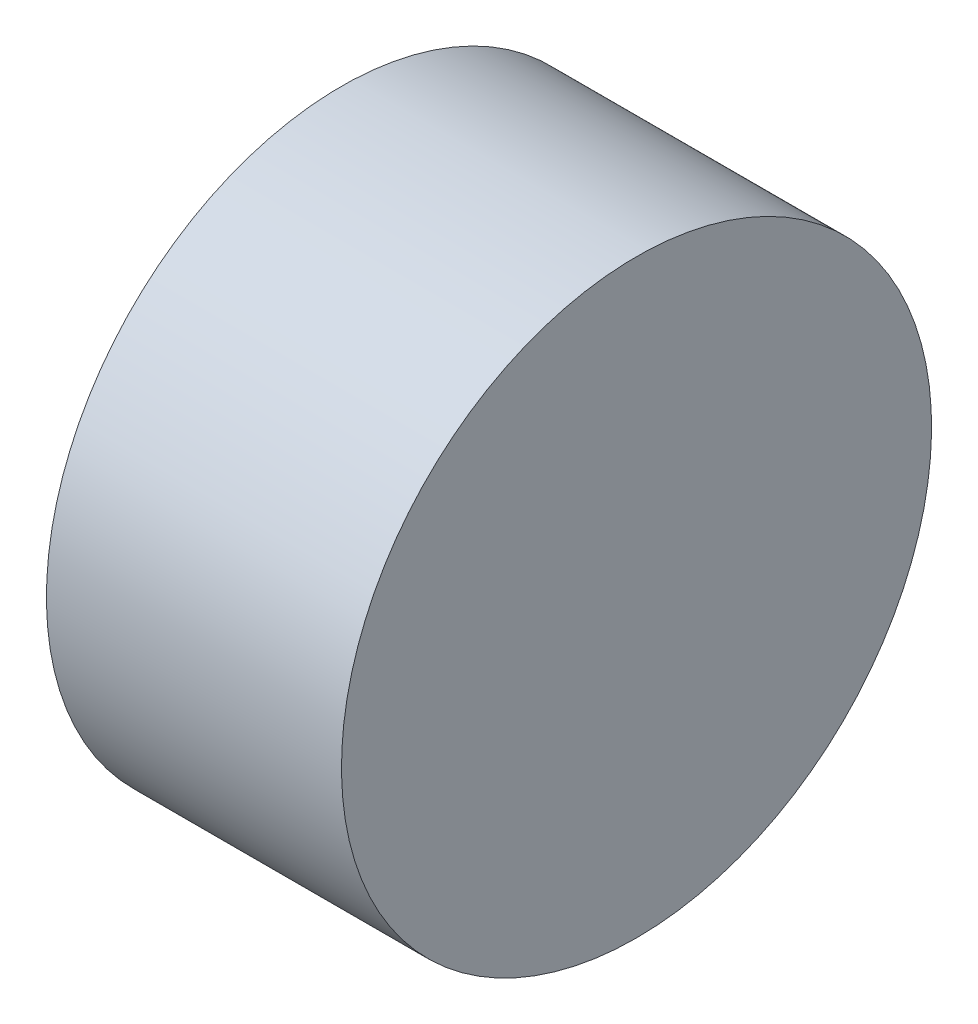
ISO-10303-21;
HEADER;
FILE_DESCRIPTION(('STEP AP214'),'2;1');
FILE_NAME('part.step','',(''),(''),'','','');
FILE_SCHEMA(('AUTOMOTIVE_DESIGN { 1 0 10303 214 1 1 1 1 }'));
ENDSEC;
DATA;
#1=APPLICATION_CONTEXT('core data for automotive mechanical design processes');
#2=APPLICATION_PROTOCOL_DEFINITION('international standard','automotive_design',2000,#1);
#3=PRODUCT_CONTEXT('',#1,'mechanical');
#4=PRODUCT('Part','Part','',(#3));
#5=PRODUCT_RELATED_PRODUCT_CATEGORY('part','',(#4));
#6=PRODUCT_DEFINITION_FORMATION('','',#4);
#7=PRODUCT_DEFINITION_CONTEXT('part definition',#1,'design');
#8=PRODUCT_DEFINITION('design','',#6,#7);
#9=PRODUCT_DEFINITION_SHAPE('','',#8);
#10=(LENGTH_UNIT() NAMED_UNIT(*) SI_UNIT(.MILLI.,.METRE.));
#11=(NAMED_UNIT(*) PLANE_ANGLE_UNIT() SI_UNIT($,.RADIAN.));
#12=(NAMED_UNIT(*) SI_UNIT($,.STERADIAN.) SOLID_ANGLE_UNIT());
#13=UNCERTAINTY_MEASURE_WITH_UNIT(LENGTH_MEASURE(1.E-05),#10,'distance_accuracy_value','');
#14=(GEOMETRIC_REPRESENTATION_CONTEXT(3) GLOBAL_UNCERTAINTY_ASSIGNED_CONTEXT((#13)) GLOBAL_UNIT_ASSIGNED_CONTEXT((#10,
#11,#12)) REPRESENTATION_CONTEXT('',''));
#15=CARTESIAN_POINT('',(0.,0.,0.));
#16=DIRECTION('',(0.,0.,1.));
#17=DIRECTION('',(1.,0.,0.));
#18=AXIS2_PLACEMENT_3D('',#15,#16,#17);
#19=CARTESIAN_POINT('',(-12.750267124833,2.2459752918337,0.));
#20=DIRECTION('',(0.,1.,0.));
#21=DIRECTION('',(-1.,0.,0.));
#22=AXIS2_PLACEMENT_3D('',#19,#20,#21);
#23=SPHERICAL_SURFACE('',#22,5.1054);
#24=CARTESIAN_POINT('',(-12.750267124833,7.3513752918337,0.));
#25=VERTEX_POINT('',#24);
#26=VERTEX_LOOP('',#25);
#27=FACE_BOUND('',#26,.T.);
#28=ADVANCED_FACE('F39',(#27),#23,.T.);
#29=CLOSED_SHELL('',(#28));
#30=MANIFOLD_SOLID_BREP('B2',#29);
#31=CARTESIAN_POINT('',(-2.59026712483303,14.6919752918337,6.35));
#32=DIRECTION('',(0.,0.,1.));
#33=DIRECTION('',(1.,0.,0.));
#34=AXIS2_PLACEMENT_3D('',#31,#32,#33);
#35=PLANE('',#34);
#36=CARTESIAN_POINT('',(-2.59026712483303,14.6919752918337,6.35));
#37=DIRECTION('',(0.,0.,1.));
#38=DIRECTION('',(1.,0.,0.));
#39=AXIS2_PLACEMENT_3D('',#36,#37,#38);
#40=CIRCLE('',#39,1.905);
#41=CARTESIAN_POINT('',(-0.685267124833033,14.6919752918337,6.35));
#42=VERTEX_POINT('',#41);
#43=EDGE_CURVE('E125',#42,#42,#40,.T.);
#44=ORIENTED_EDGE('',*,*,#43,.F.);
#45=EDGE_LOOP('',(#44));
#46=FACE_BOUND('',#45,.T.);
#47=CARTESIAN_POINT('',(-2.59026712483303,14.6919752918337,6.35));
#48=DIRECTION('',(0.,0.,1.));
#49=DIRECTION('',(1.,0.,0.));
#50=AXIS2_PLACEMENT_3D('',#47,#48,#49);
#51=CIRCLE('',#50,4.32358968551349);
#52=CARTESIAN_POINT('',(-1.26229326673769,10.5773777172349,6.35));
#53=VERTEX_POINT('',#52);
#54=CARTESIAN_POINT('',(-2.59026712483303,10.3683856063202,6.35));
#55=VERTEX_POINT('',#54);
#56=EDGE_CURVE('E110',#53,#55,#51,.T.);
#57=ORIENTED_EDGE('',*,*,#56,.T.);
#58=DIRECTION('',(0.,-1.,0.));
#59=VECTOR('',#58,1.);
#60=CARTESIAN_POINT('',(-2.59026712483303,10.3683856063202,6.35));
#61=LINE('',#60,#59);
#62=CARTESIAN_POINT('',(-2.59026712483303,-5.87643502265281,6.35));
#63=VERTEX_POINT('',#62);
#64=EDGE_CURVE('E105',#55,#63,#61,.T.);
#65=ORIENTED_EDGE('',*,*,#64,.T.);
#66=CARTESIAN_POINT('',(-2.59026712483303,-10.2000247081663,6.35));
#67=DIRECTION('',(0.,0.,1.));
#68=DIRECTION('',(1.,0.,0.));
#69=AXIS2_PLACEMENT_3D('',#66,#67,#68);
#70=CIRCLE('',#69,4.32358968551349);
#71=CARTESIAN_POINT('',(1.24129482385524,-8.19688696900736,6.35));
#72=VERTEX_POINT('',#71);
#73=EDGE_CURVE('E108',#63,#72,#70,.T.);
#74=ORIENTED_EDGE('',*,*,#73,.T.);
#75=DIRECTION('',(-0.13218202145568,0.991225460328724,0.));
#76=VECTOR('',#75,1.);
#77=CARTESIAN_POINT('',(-1.26229326673769,10.5773777172349,6.35));
#78=LINE('',#77,#76);
#79=EDGE_CURVE('E75',#72,#53,#78,.T.);
#80=ORIENTED_EDGE('',*,*,#79,.T.);
#81=EDGE_LOOP('',(#57,#65,#74,#80));
#82=FACE_BOUND('',#81,.T.);
#83=CARTESIAN_POINT('',(-2.59026712483303,-10.2000247081663,6.35));
#84=DIRECTION('',(0.,0.,1.));
#85=DIRECTION('',(1.,0.,0.));
#86=AXIS2_PLACEMENT_3D('',#83,#84,#85);
#87=CIRCLE('',#86,1.905);
#88=CARTESIAN_POINT('',(-0.685267124833033,-10.2000247081663,6.35));
#89=VERTEX_POINT('',#88);
#90=EDGE_CURVE('E140',#89,#89,#87,.T.);
#91=ORIENTED_EDGE('',*,*,#90,.F.);
#92=EDGE_LOOP('',(#91));
#93=FACE_BOUND('',#92,.T.);
#94=ADVANCED_FACE('F58',(#46,#82,#93),#35,.T.);
#95=CARTESIAN_POINT('',(-2.59026712483303,14.6919752918337,-6.35));
#96=DIRECTION('',(0.,0.,1.));
#97=DIRECTION('',(1.,0.,0.));
#98=AXIS2_PLACEMENT_3D('',#95,#96,#97);
#99=PLANE('',#98);
#100=CARTESIAN_POINT('',(-2.59026712483303,14.6919752918337,-6.35));
#101=DIRECTION('',(0.,0.,1.));
#102=DIRECTION('',(1.,0.,0.));
#103=AXIS2_PLACEMENT_3D('',#100,#101,#102);
#104=CIRCLE('',#103,1.905);
#105=CARTESIAN_POINT('',(-0.685267124833033,14.6919752918337,-6.35));
#106=VERTEX_POINT('',#105);
#107=EDGE_CURVE('E137',#106,#106,#104,.T.);
#108=ORIENTED_EDGE('',*,*,#107,.T.);
#109=EDGE_LOOP('',(#108));
#110=FACE_BOUND('',#109,.T.);
#111=CARTESIAN_POINT('',(-2.59026712483303,14.6919752918337,-6.35));
#112=DIRECTION('',(0.,0.,1.));
#113=DIRECTION('',(1.,0.,0.));
#114=AXIS2_PLACEMENT_3D('',#111,#112,#113);
#115=CIRCLE('',#114,4.32358968551349);
#116=CARTESIAN_POINT('',(-1.26229326673769,10.5773777172349,-6.35));
#117=VERTEX_POINT('',#116);
#118=CARTESIAN_POINT('',(-2.59026712483303,10.3683856063202,-6.35));
#119=VERTEX_POINT('',#118);
#120=EDGE_CURVE('E122',#117,#119,#115,.T.);
#121=ORIENTED_EDGE('',*,*,#120,.F.);
#122=DIRECTION('',(-0.13218202145568,0.991225460328724,0.));
#123=VECTOR('',#122,1.);
#124=CARTESIAN_POINT('',(-1.26229326673769,10.5773777172349,-6.35));
#125=LINE('',#124,#123);
#126=CARTESIAN_POINT('',(1.24129482385524,-8.19688696900736,-6.35));
#127=VERTEX_POINT('',#126);
#128=EDGE_CURVE('E98',#127,#117,#125,.T.);
#129=ORIENTED_EDGE('',*,*,#128,.F.);
#130=CARTESIAN_POINT('',(-2.59026712483303,-10.2000247081663,-6.35));
#131=DIRECTION('',(0.,0.,1.));
#132=DIRECTION('',(1.,0.,0.));
#133=AXIS2_PLACEMENT_3D('',#130,#131,#132);
#134=CIRCLE('',#133,4.32358968551349);
#135=CARTESIAN_POINT('',(-2.59026712483303,-5.87643502265281,-6.35));
#136=VERTEX_POINT('',#135);
#137=EDGE_CURVE('E92',#136,#127,#134,.T.);
#138=ORIENTED_EDGE('',*,*,#137,.F.);
#139=DIRECTION('',(0.,-1.,0.));
#140=VECTOR('',#139,1.);
#141=CARTESIAN_POINT('',(-2.59026712483303,10.3683856063202,-6.35));
#142=LINE('',#141,#140);
#143=EDGE_CURVE('E114',#119,#136,#142,.T.);
#144=ORIENTED_EDGE('',*,*,#143,.F.);
#145=EDGE_LOOP('',(#121,#129,#138,#144));
#146=FACE_BOUND('',#145,.T.);
#147=CARTESIAN_POINT('',(-2.59026712483303,-10.2000247081663,-6.35));
#148=DIRECTION('',(0.,0.,1.));
#149=DIRECTION('',(1.,0.,0.));
#150=AXIS2_PLACEMENT_3D('',#147,#148,#149);
#151=CIRCLE('',#150,1.905);
#152=CARTESIAN_POINT('',(-0.685267124833033,-10.2000247081663,-6.35));
#153=VERTEX_POINT('',#152);
#154=EDGE_CURVE('E143',#153,#153,#151,.T.);
#155=ORIENTED_EDGE('',*,*,#154,.T.);
#156=EDGE_LOOP('',(#155));
#157=FACE_BOUND('',#156,.T.);
#158=ADVANCED_FACE('F133',(#110,#146,#157),#99,.F.);
#159=CARTESIAN_POINT('',(-2.59026712483303,14.6919752918337,6.35));
#160=DIRECTION('',(0.,0.,-1.));
#161=DIRECTION('',(-1.,0.,0.));
#162=AXIS2_PLACEMENT_3D('',#159,#160,#161);
#163=CYLINDRICAL_SURFACE('',#162,4.32358968551349);
#164=ORIENTED_EDGE('',*,*,#120,.T.);
#165=DIRECTION('',(0.,0.,-1.));
#166=VECTOR('',#165,1.);
#167=CARTESIAN_POINT('',(-2.59026712483303,10.3683856063202,6.35));
#168=LINE('',#167,#166);
#169=EDGE_CURVE('E37',#55,#119,#168,.T.);
#170=ORIENTED_EDGE('',*,*,#169,.F.);
#171=ORIENTED_EDGE('',*,*,#56,.F.);
#172=DIRECTION('',(0.,0.,-1.));
#173=VECTOR('',#172,1.);
#174=CARTESIAN_POINT('',(-1.26229326673769,10.5773777172349,6.35));
#175=LINE('',#174,#173);
#176=EDGE_CURVE('E118',#53,#117,#175,.T.);
#177=ORIENTED_EDGE('',*,*,#176,.T.);
#178=EDGE_LOOP('',(#164,#170,#171,#177));
#179=FACE_BOUND('',#178,.T.);
#180=ADVANCED_FACE('F60',(#179),#163,.T.);
#181=CARTESIAN_POINT('',(-2.59026712483303,10.3683856063202,6.35));
#182=DIRECTION('',(1.,0.,0.));
#183=DIRECTION('',(0.,1.,0.));
#184=AXIS2_PLACEMENT_3D('',#181,#182,#183);
#185=PLANE('',#184);
#186=ORIENTED_EDGE('',*,*,#143,.T.);
#187=DIRECTION('',(0.,0.,-1.));
#188=VECTOR('',#187,1.);
#189=CARTESIAN_POINT('',(-2.59026712483303,-5.87643502265281,6.35));
#190=LINE('',#189,#188);
#191=EDGE_CURVE('E67',#63,#136,#190,.T.);
#192=ORIENTED_EDGE('',*,*,#191,.F.);
#193=ORIENTED_EDGE('',*,*,#64,.F.);
#194=ORIENTED_EDGE('',*,*,#169,.T.);
#195=EDGE_LOOP('',(#186,#192,#193,#194));
#196=FACE_BOUND('',#195,.T.);
#197=ADVANCED_FACE('F113',(#196),#185,.F.);
#198=CARTESIAN_POINT('',(-2.59026712483303,-10.2000247081663,6.35));
#199=DIRECTION('',(0.,0.,-1.));
#200=DIRECTION('',(-1.,0.,0.));
#201=AXIS2_PLACEMENT_3D('',#198,#199,#200);
#202=CYLINDRICAL_SURFACE('',#201,4.32358968551349);
#203=ORIENTED_EDGE('',*,*,#137,.T.);
#204=DIRECTION('',(0.,0.,-1.));
#205=VECTOR('',#204,1.);
#206=CARTESIAN_POINT('',(1.24129482385524,-8.19688696900736,6.35));
#207=LINE('',#206,#205);
#208=EDGE_CURVE('E115',#72,#127,#207,.T.);
#209=ORIENTED_EDGE('',*,*,#208,.F.);
#210=ORIENTED_EDGE('',*,*,#73,.F.);
#211=ORIENTED_EDGE('',*,*,#191,.T.);
#212=EDGE_LOOP('',(#203,#209,#210,#211));
#213=FACE_BOUND('',#212,.T.);
#214=ADVANCED_FACE('F116',(#213),#202,.T.);
#215=CARTESIAN_POINT('',(-1.26229326673769,10.5773777172349,6.35));
#216=DIRECTION('',(-0.991225460328724,-0.13218202145568,0.));
#217=DIRECTION('',(0.13218202145568,-0.991225460328724,0.));
#218=AXIS2_PLACEMENT_3D('',#215,#216,#217);
#219=PLANE('',#218);
#220=ORIENTED_EDGE('',*,*,#128,.T.);
#221=ORIENTED_EDGE('',*,*,#176,.F.);
#222=ORIENTED_EDGE('',*,*,#79,.F.);
#223=ORIENTED_EDGE('',*,*,#208,.T.);
#224=EDGE_LOOP('',(#220,#221,#222,#223));
#225=FACE_BOUND('',#224,.T.);
#226=ADVANCED_FACE('F130',(#225),#219,.F.);
#227=CARTESIAN_POINT('',(-2.59026712483303,14.6919752918337,6.35));
#228=DIRECTION('',(0.,0.,-1.));
#229=DIRECTION('',(-1.,0.,0.));
#230=AXIS2_PLACEMENT_3D('',#227,#228,#229);
#231=CYLINDRICAL_SURFACE('',#230,1.905);
#232=ORIENTED_EDGE('',*,*,#43,.T.);
#233=EDGE_LOOP('',(#232));
#234=FACE_BOUND('',#233,.T.);
#235=ORIENTED_EDGE('',*,*,#107,.F.);
#236=EDGE_LOOP('',(#235));
#237=FACE_BOUND('',#236,.T.);
#238=ADVANCED_FACE('F161',(#234,#237),#231,.F.);
#239=CARTESIAN_POINT('',(-2.59026712483303,-10.2000247081663,6.35));
#240=DIRECTION('',(0.,0.,-1.));
#241=DIRECTION('',(-1.,0.,0.));
#242=AXIS2_PLACEMENT_3D('',#239,#240,#241);
#243=CYLINDRICAL_SURFACE('',#242,1.905);
#244=ORIENTED_EDGE('',*,*,#90,.T.);
#245=EDGE_LOOP('',(#244));
#246=FACE_BOUND('',#245,.T.);
#247=ORIENTED_EDGE('',*,*,#154,.F.);
#248=EDGE_LOOP('',(#247));
#249=FACE_BOUND('',#248,.T.);
#250=ADVANCED_FACE('F149',(#246,#249),#243,.F.);
#251=CLOSED_SHELL('',(#94,#158,#180,#197,#214,#226,#238,#250));
#252=MANIFOLD_SOLID_BREP('B6',#251);
#253=CARTESIAN_POINT('',(15.24,-33.02,0.));
#254=DIRECTION('',(-1.,0.,0.));
#255=DIRECTION('',(0.,-1.,0.));
#256=AXIS2_PLACEMENT_3D('',#253,#254,#255);
#257=PLANE('',#256);
#258=CARTESIAN_POINT('',(15.24,0.,0.));
#259=DIRECTION('',(-1.,0.,0.));
#260=DIRECTION('',(0.,-1.,0.));
#261=AXIS2_PLACEMENT_3D('',#258,#259,#260);
#262=CIRCLE('',#261,33.02);
#263=CARTESIAN_POINT('',(15.24,-33.02,0.));
#264=VERTEX_POINT('',#263);
#265=EDGE_CURVE('E57',#264,#264,#262,.T.);
#266=ORIENTED_EDGE('',*,*,#265,.T.);
#267=EDGE_LOOP('',(#266));
#268=FACE_BOUND('',#267,.T.);
#269=ADVANCED_FACE('F223',(#268),#257,.T.);
#270=CARTESIAN_POINT('',(15.24,0.,0.));
#271=DIRECTION('',(-1.,0.,0.));
#272=DIRECTION('',(0.,-1.,0.));
#273=AXIS2_PLACEMENT_3D('',#270,#271,#272);
#274=CYLINDRICAL_SURFACE('',#273,33.02);
#275=CARTESIAN_POINT('',(0.,0.,0.));
#276=DIRECTION('',(-1.,0.,0.));
#277=DIRECTION('',(0.,-1.,0.));
#278=AXIS2_PLACEMENT_3D('',#275,#276,#277);
#279=CIRCLE('',#278,33.02);
#280=CARTESIAN_POINT('',(0.,-33.02,0.));
#281=VERTEX_POINT('',#280);
#282=EDGE_CURVE('E229',#281,#281,#279,.T.);
#283=ORIENTED_EDGE('',*,*,#282,.T.);
#284=EDGE_LOOP('',(#283));
#285=FACE_BOUND('',#284,.T.);
#286=ORIENTED_EDGE('',*,*,#265,.F.);
#287=EDGE_LOOP('',(#286));
#288=FACE_BOUND('',#287,.T.);
#289=ADVANCED_FACE('F255',(#285,#288),#274,.F.);
#290=CARTESIAN_POINT('',(0.,-50.8,0.));
#291=DIRECTION('',(-1.,0.,0.));
#292=DIRECTION('',(0.,-1.,0.));
#293=AXIS2_PLACEMENT_3D('',#290,#291,#292);
#294=PLANE('',#293);
#295=CARTESIAN_POINT('',(0.,0.,0.));
#296=DIRECTION('',(-1.,0.,0.));
#297=DIRECTION('',(0.,-1.,0.));
#298=AXIS2_PLACEMENT_3D('',#295,#296,#297);
#299=CIRCLE('',#298,50.8);
#300=CARTESIAN_POINT('',(0.,-50.8,0.));
#301=VERTEX_POINT('',#300);
#302=EDGE_CURVE('E233',#301,#301,#299,.T.);
#303=ORIENTED_EDGE('',*,*,#302,.T.);
#304=EDGE_LOOP('',(#303));
#305=FACE_BOUND('',#304,.T.);
#306=ORIENTED_EDGE('',*,*,#282,.F.);
#307=EDGE_LOOP('',(#306));
#308=FACE_BOUND('',#307,.T.);
#309=ADVANCED_FACE('F252',(#305,#308),#294,.T.);
#310=CARTESIAN_POINT('',(15.24,0.,0.));
#311=DIRECTION('',(-1.,0.,0.));
#312=DIRECTION('',(0.,-1.,0.));
#313=AXIS2_PLACEMENT_3D('',#310,#311,#312);
#314=CYLINDRICAL_SURFACE('',#313,50.8);
#315=CARTESIAN_POINT('',(50.8,0.,0.));
#316=DIRECTION('',(-1.,0.,0.));
#317=DIRECTION('',(0.,-1.,0.));
#318=AXIS2_PLACEMENT_3D('',#315,#316,#317);
#319=CIRCLE('',#318,50.8);
#320=CARTESIAN_POINT('',(50.8,-50.8,0.));
#321=VERTEX_POINT('',#320);
#322=EDGE_CURVE('E237',#321,#321,#319,.T.);
#323=ORIENTED_EDGE('',*,*,#322,.T.);
#324=EDGE_LOOP('',(#323));
#325=FACE_BOUND('',#324,.T.);
#326=ORIENTED_EDGE('',*,*,#302,.F.);
#327=EDGE_LOOP('',(#326));
#328=FACE_BOUND('',#327,.T.);
#329=ADVANCED_FACE('F243',(#325,#328),#314,.T.);
#330=CARTESIAN_POINT('',(50.8,-50.8,0.));
#331=DIRECTION('',(1.,0.,0.));
#332=DIRECTION('',(0.,1.,0.));
#333=AXIS2_PLACEMENT_3D('',#330,#331,#332);
#334=PLANE('',#333);
#335=ORIENTED_EDGE('',*,*,#322,.F.);
#336=EDGE_LOOP('',(#335));
#337=FACE_BOUND('',#336,.T.);
#338=ADVANCED_FACE('F246',(#337),#334,.T.);
#339=CLOSED_SHELL('',(#269,#289,#309,#329,#338));
#340=MANIFOLD_SOLID_BREP('B31',#339);
#341=ADVANCED_BREP_SHAPE_REPRESENTATION('',(#18,#30,#252,#340),#14);
#342=SHAPE_DEFINITION_REPRESENTATION(#9,#341);
ENDSEC;
END-ISO-10303-21;
